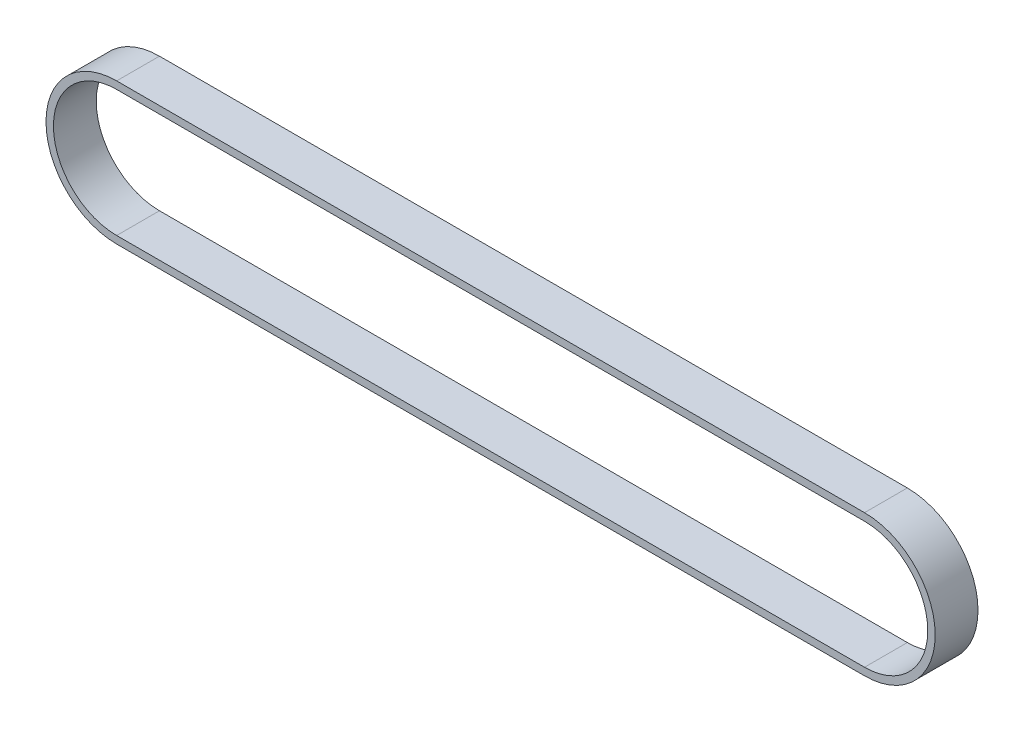
ISO-10303-21;
HEADER;
FILE_DESCRIPTION(('STEP AP214'),'2;1');
FILE_NAME('part.step','',(''),(''),'','','');
FILE_SCHEMA(('AUTOMOTIVE_DESIGN { 1 0 10303 214 1 1 1 1 }'));
ENDSEC;
DATA;
#1=APPLICATION_CONTEXT('core data for automotive mechanical design processes');
#2=APPLICATION_PROTOCOL_DEFINITION('international standard','automotive_design',2000,#1);
#3=PRODUCT_CONTEXT('',#1,'mechanical');
#4=PRODUCT('Part','Part','',(#3));
#5=PRODUCT_RELATED_PRODUCT_CATEGORY('part','',(#4));
#6=PRODUCT_DEFINITION_FORMATION('','',#4);
#7=PRODUCT_DEFINITION_CONTEXT('part definition',#1,'design');
#8=PRODUCT_DEFINITION('design','',#6,#7);
#9=PRODUCT_DEFINITION_SHAPE('','',#8);
#10=(LENGTH_UNIT() NAMED_UNIT(*) SI_UNIT(.MILLI.,.METRE.));
#11=(NAMED_UNIT(*) PLANE_ANGLE_UNIT() SI_UNIT($,.RADIAN.));
#12=(NAMED_UNIT(*) SI_UNIT($,.STERADIAN.) SOLID_ANGLE_UNIT());
#13=UNCERTAINTY_MEASURE_WITH_UNIT(LENGTH_MEASURE(1.E-05),#10,'distance_accuracy_value','');
#14=(GEOMETRIC_REPRESENTATION_CONTEXT(3) GLOBAL_UNCERTAINTY_ASSIGNED_CONTEXT((#13)) GLOBAL_UNIT_ASSIGNED_CONTEXT((#10,
#11,#12)) REPRESENTATION_CONTEXT('',''));
#15=CARTESIAN_POINT('',(0.,0.,0.));
#16=DIRECTION('',(0.,0.,1.));
#17=DIRECTION('',(1.,0.,0.));
#18=AXIS2_PLACEMENT_3D('',#15,#16,#17);
#19=CARTESIAN_POINT('',(111.77,0.,6.4));
#20=DIRECTION('',(0.,0.,-1.));
#21=DIRECTION('',(-1.,0.,0.));
#22=AXIS2_PLACEMENT_3D('',#19,#20,#21);
#23=CYLINDRICAL_SURFACE('',#22,10.56);
#24=CARTESIAN_POINT('',(111.77,0.,0.));
#25=DIRECTION('',(0.,0.,1.));
#26=DIRECTION('',(1.,0.,0.));
#27=AXIS2_PLACEMENT_3D('',#24,#25,#26);
#28=CIRCLE('',#27,10.56);
#29=CARTESIAN_POINT('',(111.77,-10.56,0.));
#30=VERTEX_POINT('',#29);
#31=CARTESIAN_POINT('',(111.77,10.56,0.));
#32=VERTEX_POINT('',#31);
#33=EDGE_CURVE('E151',#30,#32,#28,.T.);
#34=ORIENTED_EDGE('',*,*,#33,.T.);
#35=DIRECTION('',(0.,0.,-1.));
#36=VECTOR('',#35,1.);
#37=CARTESIAN_POINT('',(111.77,10.56,6.4));
#38=LINE('',#37,#36);
#39=CARTESIAN_POINT('',(111.77,10.56,6.4));
#40=VERTEX_POINT('',#39);
#41=EDGE_CURVE('E11',#40,#32,#38,.T.);
#42=ORIENTED_EDGE('',*,*,#41,.F.);
#43=CARTESIAN_POINT('',(111.77,0.,6.4));
#44=DIRECTION('',(0.,0.,1.));
#45=DIRECTION('',(1.,0.,0.));
#46=AXIS2_PLACEMENT_3D('',#43,#44,#45);
#47=CIRCLE('',#46,10.56);
#48=CARTESIAN_POINT('',(111.77,-10.56,6.4));
#49=VERTEX_POINT('',#48);
#50=EDGE_CURVE('E157',#49,#40,#47,.T.);
#51=ORIENTED_EDGE('',*,*,#50,.F.);
#52=DIRECTION('',(0.,0.,-1.));
#53=VECTOR('',#52,1.);
#54=CARTESIAN_POINT('',(111.77,-10.56,6.4));
#55=LINE('',#54,#53);
#56=EDGE_CURVE('E171',#49,#30,#55,.T.);
#57=ORIENTED_EDGE('',*,*,#56,.T.);
#58=EDGE_LOOP('',(#34,#42,#51,#57));
#59=FACE_BOUND('',#58,.T.);
#60=ADVANCED_FACE('F43',(#59),#23,.T.);
#61=CARTESIAN_POINT('',(0.,10.56,6.4));
#62=DIRECTION('',(0.,-1.,0.));
#63=DIRECTION('',(0.,0.,-1.));
#64=AXIS2_PLACEMENT_3D('',#61,#62,#63);
#65=PLANE('',#64);
#66=DIRECTION('',(-1.,0.,0.));
#67=VECTOR('',#66,1.);
#68=CARTESIAN_POINT('',(0.,10.56,0.));
#69=LINE('',#68,#67);
#70=CARTESIAN_POINT('',(0.,10.56,0.));
#71=VERTEX_POINT('',#70);
#72=EDGE_CURVE('E175',#32,#71,#69,.T.);
#73=ORIENTED_EDGE('',*,*,#72,.T.);
#74=DIRECTION('',(0.,0.,-1.));
#75=VECTOR('',#74,1.);
#76=CARTESIAN_POINT('',(0.,10.56,6.4));
#77=LINE('',#76,#75);
#78=CARTESIAN_POINT('',(0.,10.56,6.4));
#79=VERTEX_POINT('',#78);
#80=EDGE_CURVE('E51',#79,#71,#77,.T.);
#81=ORIENTED_EDGE('',*,*,#80,.F.);
#82=DIRECTION('',(-1.,0.,0.));
#83=VECTOR('',#82,1.);
#84=CARTESIAN_POINT('',(0.,10.56,6.4));
#85=LINE('',#84,#83);
#86=EDGE_CURVE('E161',#40,#79,#85,.T.);
#87=ORIENTED_EDGE('',*,*,#86,.F.);
#88=ORIENTED_EDGE('',*,*,#41,.T.);
#89=EDGE_LOOP('',(#73,#81,#87,#88));
#90=FACE_BOUND('',#89,.T.);
#91=ADVANCED_FACE('F209',(#90),#65,.F.);
#92=CARTESIAN_POINT('',(0.,0.,6.4));
#93=DIRECTION('',(0.,0.,-1.));
#94=DIRECTION('',(-1.,0.,0.));
#95=AXIS2_PLACEMENT_3D('',#92,#93,#94);
#96=CYLINDRICAL_SURFACE('',#95,10.56);
#97=CARTESIAN_POINT('',(0.,0.,0.));
#98=DIRECTION('',(0.,0.,1.));
#99=DIRECTION('',(1.,0.,0.));
#100=AXIS2_PLACEMENT_3D('',#97,#98,#99);
#101=CIRCLE('',#100,10.56);
#102=CARTESIAN_POINT('',(0.,-10.56,0.));
#103=VERTEX_POINT('',#102);
#104=EDGE_CURVE('E178',#71,#103,#101,.T.);
#105=ORIENTED_EDGE('',*,*,#104,.T.);
#106=DIRECTION('',(0.,0.,-1.));
#107=VECTOR('',#106,1.);
#108=CARTESIAN_POINT('',(0.,-10.56,6.4));
#109=LINE('',#108,#107);
#110=CARTESIAN_POINT('',(0.,-10.56,6.4));
#111=VERTEX_POINT('',#110);
#112=EDGE_CURVE('E186',#111,#103,#109,.T.);
#113=ORIENTED_EDGE('',*,*,#112,.F.);
#114=CARTESIAN_POINT('',(0.,0.,6.4));
#115=DIRECTION('',(0.,0.,1.));
#116=DIRECTION('',(1.,0.,0.));
#117=AXIS2_PLACEMENT_3D('',#114,#115,#116);
#118=CIRCLE('',#117,10.56);
#119=EDGE_CURVE('E165',#79,#111,#118,.T.);
#120=ORIENTED_EDGE('',*,*,#119,.F.);
#121=ORIENTED_EDGE('',*,*,#80,.T.);
#122=EDGE_LOOP('',(#105,#113,#120,#121));
#123=FACE_BOUND('',#122,.T.);
#124=ADVANCED_FACE('F195',(#123),#96,.T.);
#125=CARTESIAN_POINT('',(0.,-10.56,6.4));
#126=DIRECTION('',(0.,1.,0.));
#127=DIRECTION('',(0.,0.,1.));
#128=AXIS2_PLACEMENT_3D('',#125,#126,#127);
#129=PLANE('',#128);
#130=DIRECTION('',(1.,0.,0.));
#131=VECTOR('',#130,1.);
#132=CARTESIAN_POINT('',(0.,-10.56,0.));
#133=LINE('',#132,#131);
#134=EDGE_CURVE('E162',#103,#30,#133,.T.);
#135=ORIENTED_EDGE('',*,*,#134,.T.);
#136=ORIENTED_EDGE('',*,*,#56,.F.);
#137=DIRECTION('',(1.,0.,0.));
#138=VECTOR('',#137,1.);
#139=CARTESIAN_POINT('',(0.,-10.56,6.4));
#140=LINE('',#139,#138);
#141=EDGE_CURVE('E168',#111,#49,#140,.T.);
#142=ORIENTED_EDGE('',*,*,#141,.F.);
#143=ORIENTED_EDGE('',*,*,#112,.T.);
#144=EDGE_LOOP('',(#135,#136,#142,#143));
#145=FACE_BOUND('',#144,.T.);
#146=ADVANCED_FACE('F202',(#145),#129,.F.);
#147=CARTESIAN_POINT('',(111.77,0.,6.4));
#148=DIRECTION('',(0.,0.,1.));
#149=DIRECTION('',(1.,0.,0.));
#150=AXIS2_PLACEMENT_3D('',#147,#148,#149);
#151=PLANE('',#150);
#152=CARTESIAN_POINT('',(111.77,0.,6.4));
#153=DIRECTION('',(0.,0.,1.));
#154=DIRECTION('',(1.,0.,0.));
#155=AXIS2_PLACEMENT_3D('',#152,#153,#154);
#156=CIRCLE('',#155,9.45);
#157=CARTESIAN_POINT('',(111.77,-9.45,6.4));
#158=VERTEX_POINT('',#157);
#159=CARTESIAN_POINT('',(111.77,9.45,6.4));
#160=VERTEX_POINT('',#159);
#161=EDGE_CURVE('E58',#158,#160,#156,.T.);
#162=ORIENTED_EDGE('',*,*,#161,.F.);
#163=DIRECTION('',(1.,0.,0.));
#164=VECTOR('',#163,1.);
#165=CARTESIAN_POINT('',(0.,-9.45,6.4));
#166=LINE('',#165,#164);
#167=CARTESIAN_POINT('',(0.,-9.45,6.4));
#168=VERTEX_POINT('',#167);
#169=EDGE_CURVE('E129',#168,#158,#166,.T.);
#170=ORIENTED_EDGE('',*,*,#169,.F.);
#171=CARTESIAN_POINT('',(0.,0.,6.4));
#172=DIRECTION('',(0.,0.,1.));
#173=DIRECTION('',(1.,0.,0.));
#174=AXIS2_PLACEMENT_3D('',#171,#172,#173);
#175=CIRCLE('',#174,9.45);
#176=CARTESIAN_POINT('',(0.,9.45,6.4));
#177=VERTEX_POINT('',#176);
#178=EDGE_CURVE('E133',#177,#168,#175,.T.);
#179=ORIENTED_EDGE('',*,*,#178,.F.);
#180=DIRECTION('',(-1.,0.,0.));
#181=VECTOR('',#180,1.);
#182=CARTESIAN_POINT('',(0.,9.45,6.4));
#183=LINE('',#182,#181);
#184=EDGE_CURVE('E142',#160,#177,#183,.T.);
#185=ORIENTED_EDGE('',*,*,#184,.F.);
#186=EDGE_LOOP('',(#162,#170,#179,#185));
#187=FACE_BOUND('',#186,.T.);
#188=ORIENTED_EDGE('',*,*,#50,.T.);
#189=ORIENTED_EDGE('',*,*,#86,.T.);
#190=ORIENTED_EDGE('',*,*,#119,.T.);
#191=ORIENTED_EDGE('',*,*,#141,.T.);
#192=EDGE_LOOP('',(#188,#189,#190,#191));
#193=FACE_BOUND('',#192,.T.);
#194=ADVANCED_FACE('F208',(#187,#193),#151,.T.);
#195=CARTESIAN_POINT('',(111.77,0.,0.));
#196=DIRECTION('',(0.,0.,1.));
#197=DIRECTION('',(1.,0.,0.));
#198=AXIS2_PLACEMENT_3D('',#195,#196,#197);
#199=PLANE('',#198);
#200=DIRECTION('',(1.,0.,0.));
#201=VECTOR('',#200,1.);
#202=CARTESIAN_POINT('',(0.,-9.45,0.));
#203=LINE('',#202,#201);
#204=CARTESIAN_POINT('',(0.,-9.45,0.));
#205=VERTEX_POINT('',#204);
#206=CARTESIAN_POINT('',(111.77,-9.45,0.));
#207=VERTEX_POINT('',#206);
#208=EDGE_CURVE('E117',#205,#207,#203,.T.);
#209=ORIENTED_EDGE('',*,*,#208,.T.);
#210=CARTESIAN_POINT('',(111.77,0.,0.));
#211=DIRECTION('',(0.,0.,1.));
#212=DIRECTION('',(1.,0.,0.));
#213=AXIS2_PLACEMENT_3D('',#210,#211,#212);
#214=CIRCLE('',#213,9.45);
#215=CARTESIAN_POINT('',(111.77,9.45,0.));
#216=VERTEX_POINT('',#215);
#217=EDGE_CURVE('E110',#207,#216,#214,.T.);
#218=ORIENTED_EDGE('',*,*,#217,.T.);
#219=DIRECTION('',(-1.,0.,0.));
#220=VECTOR('',#219,1.);
#221=CARTESIAN_POINT('',(0.,9.45,0.));
#222=LINE('',#221,#220);
#223=CARTESIAN_POINT('',(0.,9.45,0.));
#224=VERTEX_POINT('',#223);
#225=EDGE_CURVE('E120',#216,#224,#222,.T.);
#226=ORIENTED_EDGE('',*,*,#225,.T.);
#227=CARTESIAN_POINT('',(0.,0.,0.));
#228=DIRECTION('',(0.,0.,1.));
#229=DIRECTION('',(1.,0.,0.));
#230=AXIS2_PLACEMENT_3D('',#227,#228,#229);
#231=CIRCLE('',#230,9.45);
#232=EDGE_CURVE('E66',#224,#205,#231,.T.);
#233=ORIENTED_EDGE('',*,*,#232,.T.);
#234=EDGE_LOOP('',(#209,#218,#226,#233));
#235=FACE_BOUND('',#234,.T.);
#236=ORIENTED_EDGE('',*,*,#33,.F.);
#237=ORIENTED_EDGE('',*,*,#134,.F.);
#238=ORIENTED_EDGE('',*,*,#104,.F.);
#239=ORIENTED_EDGE('',*,*,#72,.F.);
#240=EDGE_LOOP('',(#236,#237,#238,#239));
#241=FACE_BOUND('',#240,.T.);
#242=ADVANCED_FACE('F125',(#235,#241),#199,.F.);
#243=CARTESIAN_POINT('',(111.77,0.,0.));
#244=DIRECTION('',(0.,0.,1.));
#245=DIRECTION('',(1.,0.,0.));
#246=AXIS2_PLACEMENT_3D('',#243,#244,#245);
#247=CYLINDRICAL_SURFACE('',#246,9.45);
#248=ORIENTED_EDGE('',*,*,#161,.T.);
#249=DIRECTION('',(0.,0.,1.));
#250=VECTOR('',#249,1.);
#251=CARTESIAN_POINT('',(111.77,9.45,0.));
#252=LINE('',#251,#250);
#253=EDGE_CURVE('E106',#216,#160,#252,.T.);
#254=ORIENTED_EDGE('',*,*,#253,.F.);
#255=ORIENTED_EDGE('',*,*,#217,.F.);
#256=DIRECTION('',(0.,0.,1.));
#257=VECTOR('',#256,1.);
#258=CARTESIAN_POINT('',(111.77,-9.45,0.));
#259=LINE('',#258,#257);
#260=EDGE_CURVE('E148',#207,#158,#259,.T.);
#261=ORIENTED_EDGE('',*,*,#260,.T.);
#262=EDGE_LOOP('',(#248,#254,#255,#261));
#263=FACE_BOUND('',#262,.T.);
#264=ADVANCED_FACE('F108',(#263),#247,.F.);
#265=CARTESIAN_POINT('',(0.,-9.45,0.));
#266=DIRECTION('',(0.,-1.,0.));
#267=DIRECTION('',(1.,0.,0.));
#268=AXIS2_PLACEMENT_3D('',#265,#266,#267);
#269=PLANE('',#268);
#270=ORIENTED_EDGE('',*,*,#169,.T.);
#271=ORIENTED_EDGE('',*,*,#260,.F.);
#272=ORIENTED_EDGE('',*,*,#208,.F.);
#273=DIRECTION('',(0.,0.,1.));
#274=VECTOR('',#273,1.);
#275=CARTESIAN_POINT('',(0.,-9.45,0.));
#276=LINE('',#275,#274);
#277=EDGE_CURVE('E152',#205,#168,#276,.T.);
#278=ORIENTED_EDGE('',*,*,#277,.T.);
#279=EDGE_LOOP('',(#270,#271,#272,#278));
#280=FACE_BOUND('',#279,.T.);
#281=ADVANCED_FACE('F226',(#280),#269,.F.);
#282=CARTESIAN_POINT('',(0.,0.,0.));
#283=DIRECTION('',(0.,0.,1.));
#284=DIRECTION('',(1.,0.,0.));
#285=AXIS2_PLACEMENT_3D('',#282,#283,#284);
#286=CYLINDRICAL_SURFACE('',#285,9.45);
#287=ORIENTED_EDGE('',*,*,#178,.T.);
#288=ORIENTED_EDGE('',*,*,#277,.F.);
#289=ORIENTED_EDGE('',*,*,#232,.F.);
#290=DIRECTION('',(0.,0.,1.));
#291=VECTOR('',#290,1.);
#292=CARTESIAN_POINT('',(0.,9.45,0.));
#293=LINE('',#292,#291);
#294=EDGE_CURVE('E116',#224,#177,#293,.T.);
#295=ORIENTED_EDGE('',*,*,#294,.T.);
#296=EDGE_LOOP('',(#287,#288,#289,#295));
#297=FACE_BOUND('',#296,.T.);
#298=ADVANCED_FACE('F229',(#297),#286,.F.);
#299=CARTESIAN_POINT('',(0.,9.45,0.));
#300=DIRECTION('',(0.,1.,0.));
#301=DIRECTION('',(-1.,0.,0.));
#302=AXIS2_PLACEMENT_3D('',#299,#300,#301);
#303=PLANE('',#302);
#304=ORIENTED_EDGE('',*,*,#184,.T.);
#305=ORIENTED_EDGE('',*,*,#294,.F.);
#306=ORIENTED_EDGE('',*,*,#225,.F.);
#307=ORIENTED_EDGE('',*,*,#253,.T.);
#308=EDGE_LOOP('',(#304,#305,#306,#307));
#309=FACE_BOUND('',#308,.T.);
#310=ADVANCED_FACE('F121',(#309),#303,.F.);
#311=CLOSED_SHELL('',(#60,#91,#124,#146,#194,#242,#264,#281,#298,#310));
#312=MANIFOLD_SOLID_BREP('B2',#311);
#313=ADVANCED_BREP_SHAPE_REPRESENTATION('',(#18,#312),#14);
#314=SHAPE_DEFINITION_REPRESENTATION(#9,#313);
ENDSEC;
END-ISO-10303-21;
